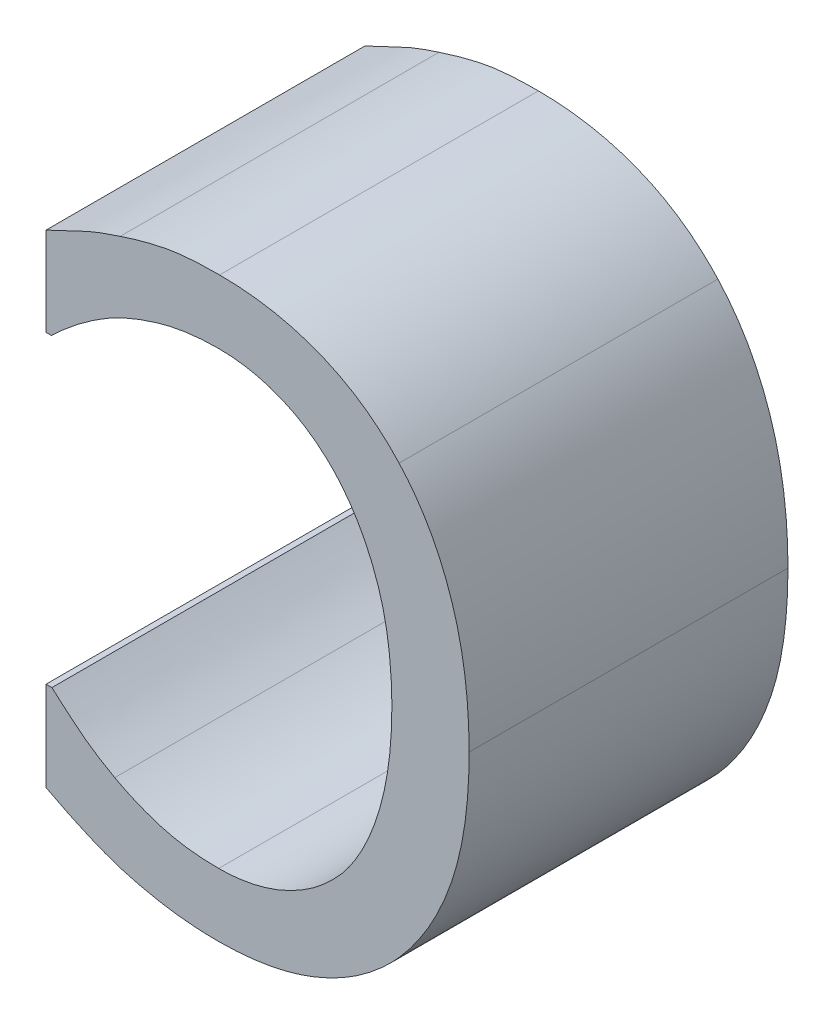
ISO-10303-21;
HEADER;
FILE_DESCRIPTION(('STEP AP214'),'2;1');
FILE_NAME('part.step','',(''),(''),'','','');
FILE_SCHEMA(('AUTOMOTIVE_DESIGN { 1 0 10303 214 1 1 1 1 }'));
ENDSEC;
DATA;
#1=APPLICATION_CONTEXT('core data for automotive mechanical design processes');
#2=APPLICATION_PROTOCOL_DEFINITION('international standard','automotive_design',2000,#1);
#3=PRODUCT_CONTEXT('',#1,'mechanical');
#4=PRODUCT('Part','Part','',(#3));
#5=PRODUCT_RELATED_PRODUCT_CATEGORY('part','',(#4));
#6=PRODUCT_DEFINITION_FORMATION('','',#4);
#7=PRODUCT_DEFINITION_CONTEXT('part definition',#1,'design');
#8=PRODUCT_DEFINITION('design','',#6,#7);
#9=PRODUCT_DEFINITION_SHAPE('','',#8);
#10=(LENGTH_UNIT() NAMED_UNIT(*) SI_UNIT(.MILLI.,.METRE.));
#11=(NAMED_UNIT(*) PLANE_ANGLE_UNIT() SI_UNIT($,.RADIAN.));
#12=(NAMED_UNIT(*) SI_UNIT($,.STERADIAN.) SOLID_ANGLE_UNIT());
#13=UNCERTAINTY_MEASURE_WITH_UNIT(LENGTH_MEASURE(1.E-05),#10,'distance_accuracy_value','');
#14=(GEOMETRIC_REPRESENTATION_CONTEXT(3) GLOBAL_UNCERTAINTY_ASSIGNED_CONTEXT((#13)) GLOBAL_UNIT_ASSIGNED_CONTEXT((#10,
#11,#12)) REPRESENTATION_CONTEXT('',''));
#15=CARTESIAN_POINT('',(0.,0.,0.));
#16=DIRECTION('',(0.,0.,1.));
#17=DIRECTION('',(1.,0.,0.));
#18=AXIS2_PLACEMENT_3D('',#15,#16,#17);
#19=CARTESIAN_POINT('',(6.6298997999722,1.566799218315,0.));
#20=CARTESIAN_POINT('',(6.6298997999722,1.566799218315,0.1));
#21=CARTESIAN_POINT('',(6.6298997999722,1.5889173394833,0.));
#22=CARTESIAN_POINT('',(6.6298997999722,1.5889173394833,0.1));
#23=CARTESIAN_POINT('',(6.6184153909041,1.6229452182036,0.));
#24=CARTESIAN_POINT('',(6.6184153909041,1.6229452182036,0.1));
#25=CARTESIAN_POINT('',(6.607923461632,1.6342878444437,0.));
#26=CARTESIAN_POINT('',(6.607923461632,1.6342878444437,0.1));
#27=B_SPLINE_SURFACE_WITH_KNOTS('',2,1,((#19,#20),(#21,#22),(#23,#24),(#25,#26)),.UNSPECIFIED.,
.F.,.F.,.F.,(3,1,3),(2,2),(-2.,-1.,0.),(0.,0.01),.UNSPECIFIED.);
#28=CARTESIAN_POINT('',(6.607923461632,1.6342878444437,0.));
#29=CARTESIAN_POINT('',(6.6184153909041,1.6229452182036,0.));
#30=CARTESIAN_POINT('',(6.6298997999722,1.5889173394833,0.));
#31=CARTESIAN_POINT('',(6.6298997999722,1.566799218315,0.));
#32=B_SPLINE_CURVE_WITH_KNOTS('',2,(#28,#29,#30,#31),.UNSPECIFIED.,.F.,.F.,(3,1,3),(0.,1.,2.),.UNSPECIFIED.);
#33=CARTESIAN_POINT('',(6.607923461632,1.6342878444437,0.));
#34=VERTEX_POINT('',#33);
#35=CARTESIAN_POINT('',(6.6298997999722,1.566799218315,0.));
#36=VERTEX_POINT('',#35);
#37=EDGE_CURVE('E11',#34,#36,#32,.T.);
#38=DIRECTION('',(0.,0.,1.));
#39=VECTOR('',#38,1.);
#40=CARTESIAN_POINT('',(6.607923461632,1.6342878444437,0.));
#41=LINE('',#40,#39);
#42=CARTESIAN_POINT('',(6.607923461632,1.6342878444437,0.1));
#43=VERTEX_POINT('',#42);
#44=EDGE_CURVE('E28',#34,#43,#41,.T.);
#45=CARTESIAN_POINT('',(6.6298997999722,1.566799218315,0.1));
#46=CARTESIAN_POINT('',(6.6298997999722,1.5889173394833,0.1));
#47=CARTESIAN_POINT('',(6.6184153909041,1.6229452182036,0.1));
#48=CARTESIAN_POINT('',(6.607923461632,1.6342878444437,0.1));
#49=B_SPLINE_CURVE_WITH_KNOTS('',2,(#45,#46,#47,#48),.UNSPECIFIED.,.F.,.F.,(3,1,3),(-2.,-1.,0.),.UNSPECIFIED.);
#50=CARTESIAN_POINT('',(6.6298997999722,1.566799218315,0.1));
#51=VERTEX_POINT('',#50);
#52=EDGE_CURVE('E176',#51,#43,#49,.T.);
#53=DIRECTION('',(0.,0.,1.));
#54=VECTOR('',#53,1.);
#55=CARTESIAN_POINT('',(6.6298997999722,1.566799218315,0.));
#56=LINE('',#55,#54);
#57=EDGE_CURVE('E460',#36,#51,#56,.T.);
#58=ORIENTED_EDGE('',*,*,#37,.F.);
#59=ORIENTED_EDGE('',*,*,#44,.T.);
#60=ORIENTED_EDGE('',*,*,#52,.F.);
#61=ORIENTED_EDGE('',*,*,#57,.F.);
#62=EDGE_LOOP('',(#58,#59,#60,#61));
#63=FACE_BOUND('',#62,.T.);
#64=ADVANCED_FACE('F17',(#63),#27,.T.);
#65=CARTESIAN_POINT('',(6.60806524446,1.5001612891544,0.));
#66=CARTESIAN_POINT('',(6.60806524446,1.5001612891544,0.1));
#67=CARTESIAN_POINT('',(6.6186989565601,1.5122128295345,0.));
#68=CARTESIAN_POINT('',(6.6186989565601,1.5122128295345,0.1));
#69=CARTESIAN_POINT('',(6.6298997999722,1.5448228799748,0.));
#70=CARTESIAN_POINT('',(6.6298997999722,1.5448228799748,0.1));
#71=CARTESIAN_POINT('',(6.6298997999722,1.566799218315,0.));
#72=CARTESIAN_POINT('',(6.6298997999722,1.566799218315,0.1));
#73=B_SPLINE_SURFACE_WITH_KNOTS('',2,1,((#65,#66),(#67,#68),(#69,#70),(#71,#72)),.UNSPECIFIED.,
.F.,.F.,.F.,(3,1,3),(2,2),(-2.,-1.,0.),(0.,0.01),.UNSPECIFIED.);
#74=CARTESIAN_POINT('',(6.6298997999722,1.566799218315,0.));
#75=CARTESIAN_POINT('',(6.6298997999722,1.5448228799748,0.));
#76=CARTESIAN_POINT('',(6.6186989565601,1.5122128295345,0.));
#77=CARTESIAN_POINT('',(6.60806524446,1.5001612891544,0.));
#78=B_SPLINE_CURVE_WITH_KNOTS('',2,(#74,#75,#76,#77),.UNSPECIFIED.,.F.,.F.,(3,1,3),(0.,1.,2.),.UNSPECIFIED.);
#79=CARTESIAN_POINT('',(6.60806524446,1.5001612891544,0.));
#80=VERTEX_POINT('',#79);
#81=EDGE_CURVE('E453',#36,#80,#78,.T.);
#82=CARTESIAN_POINT('',(6.60806524446,1.5001612891544,0.1));
#83=CARTESIAN_POINT('',(6.6186989565601,1.5122128295345,0.1));
#84=CARTESIAN_POINT('',(6.6298997999722,1.5448228799748,0.1));
#85=CARTESIAN_POINT('',(6.6298997999722,1.566799218315,0.1));
#86=B_SPLINE_CURVE_WITH_KNOTS('',2,(#82,#83,#84,#85),.UNSPECIFIED.,.F.,.F.,(3,1,3),(-2.,-1.,0.),.UNSPECIFIED.);
#87=CARTESIAN_POINT('',(6.60806524446,1.5001612891544,0.1));
#88=VERTEX_POINT('',#87);
#89=EDGE_CURVE('E449',#88,#51,#86,.T.);
#90=DIRECTION('',(0.,0.,1.));
#91=VECTOR('',#90,1.);
#92=CARTESIAN_POINT('',(6.60806524446,1.5001612891544,0.));
#93=LINE('',#92,#91);
#94=EDGE_CURVE('E443',#80,#88,#93,.T.);
#95=ORIENTED_EDGE('',*,*,#81,.F.);
#96=ORIENTED_EDGE('',*,*,#57,.T.);
#97=ORIENTED_EDGE('',*,*,#89,.F.);
#98=ORIENTED_EDGE('',*,*,#94,.F.);
#99=EDGE_LOOP('',(#95,#96,#97,#98));
#100=FACE_BOUND('',#99,.T.);
#101=ADVANCED_FACE('F538',(#100),#73,.T.);
#102=CARTESIAN_POINT('',(6.5512103304314,1.4760582083942,0.));
#103=CARTESIAN_POINT('',(6.5512103304314,1.4760582083942,0.1));
#104=CARTESIAN_POINT('',(6.5689331839316,1.4760582083942,0.));
#105=CARTESIAN_POINT('',(6.5689331839316,1.4760582083942,0.1));
#106=CARTESIAN_POINT('',(6.5975733151879,1.4883933144303,0.));
#107=CARTESIAN_POINT('',(6.5975733151879,1.4883933144303,0.1));
#108=CARTESIAN_POINT('',(6.60806524446,1.5001612891544,0.));
#109=CARTESIAN_POINT('',(6.60806524446,1.5001612891544,0.1));
#110=B_SPLINE_SURFACE_WITH_KNOTS('',2,1,((#102,#103),(#104,#105),(#106,#107),(#108,#109)),
.UNSPECIFIED.,.F.,.F.,.F.,(3,1,3),(2,2),(-2.,-1.,0.),(0.,0.01),.UNSPECIFIED.);
#111=CARTESIAN_POINT('',(6.60806524446,1.5001612891544,0.));
#112=CARTESIAN_POINT('',(6.5975733151879,1.4883933144303,0.));
#113=CARTESIAN_POINT('',(6.5689331839316,1.4760582083942,0.));
#114=CARTESIAN_POINT('',(6.5512103304314,1.4760582083942,0.));
#115=B_SPLINE_CURVE_WITH_KNOTS('',2,(#111,#112,#113,#114),.UNSPECIFIED.,.F.,.F.,(3,1,3),(0.,1.,
2.),.UNSPECIFIED.);
#116=CARTESIAN_POINT('',(6.5512103304314,1.4760582083942,0.));
#117=VERTEX_POINT('',#116);
#118=EDGE_CURVE('E436',#80,#117,#115,.T.);
#119=CARTESIAN_POINT('',(6.5512103304314,1.4760582083942,0.1));
#120=CARTESIAN_POINT('',(6.5689331839316,1.4760582083942,0.1));
#121=CARTESIAN_POINT('',(6.5975733151879,1.4883933144303,0.1));
#122=CARTESIAN_POINT('',(6.60806524446,1.5001612891544,0.1));
#123=B_SPLINE_CURVE_WITH_KNOTS('',2,(#119,#120,#121,#122),.UNSPECIFIED.,.F.,.F.,(3,1,3),(-2.,
-1.,0.),.UNSPECIFIED.);
#124=CARTESIAN_POINT('',(6.5512103304314,1.4760582083942,0.1));
#125=VERTEX_POINT('',#124);
#126=EDGE_CURVE('E431',#125,#88,#123,.T.);
#127=DIRECTION('',(0.,0.,1.));
#128=VECTOR('',#127,1.);
#129=CARTESIAN_POINT('',(6.5512103304314,1.4760582083942,0.));
#130=LINE('',#129,#128);
#131=EDGE_CURVE('E425',#117,#125,#130,.T.);
#132=ORIENTED_EDGE('',*,*,#118,.F.);
#133=ORIENTED_EDGE('',*,*,#94,.T.);
#134=ORIENTED_EDGE('',*,*,#126,.F.);
#135=ORIENTED_EDGE('',*,*,#131,.F.);
#136=EDGE_LOOP('',(#132,#133,#134,#135));
#137=FACE_BOUND('',#136,.T.);
#138=ADVANCED_FACE('F534',(#137),#110,.T.);
#139=CARTESIAN_POINT('',(6.5204434567551,1.4805952588902,0.));
#140=CARTESIAN_POINT('',(6.5204434567551,1.4805952588902,0.1));
#141=CARTESIAN_POINT('',(6.5269654668432,1.4786102992982,0.));
#142=CARTESIAN_POINT('',(6.5269654668432,1.4786102992982,0.1));
#143=CARTESIAN_POINT('',(6.5424197950953,1.4760582083942,0.));
#144=CARTESIAN_POINT('',(6.5424197950953,1.4760582083942,0.1));
#145=CARTESIAN_POINT('',(6.5512103304314,1.4760582083942,0.));
#146=CARTESIAN_POINT('',(6.5512103304314,1.4760582083942,0.1));
#147=B_SPLINE_SURFACE_WITH_KNOTS('',2,1,((#139,#140),(#141,#142),(#143,#144),(#145,#146)),
.UNSPECIFIED.,.F.,.F.,.F.,(3,1,3),(2,2),(-2.,-1.,0.),(0.,0.01),.UNSPECIFIED.);
#148=CARTESIAN_POINT('',(6.5512103304314,1.4760582083942,0.));
#149=CARTESIAN_POINT('',(6.5424197950953,1.4760582083942,0.));
#150=CARTESIAN_POINT('',(6.5269654668432,1.4786102992982,0.));
#151=CARTESIAN_POINT('',(6.5204434567551,1.4805952588902,0.));
#152=B_SPLINE_CURVE_WITH_KNOTS('',2,(#148,#149,#150,#151),.UNSPECIFIED.,.F.,.F.,(3,1,3),(0.,1.,
2.),.UNSPECIFIED.);
#153=CARTESIAN_POINT('',(6.5204434567551,1.4805952588902,0.));
#154=VERTEX_POINT('',#153);
#155=EDGE_CURVE('E418',#117,#154,#152,.T.);
#156=CARTESIAN_POINT('',(6.5204434567551,1.4805952588902,0.1));
#157=CARTESIAN_POINT('',(6.5269654668432,1.4786102992982,0.1));
#158=CARTESIAN_POINT('',(6.5424197950953,1.4760582083942,0.1));
#159=CARTESIAN_POINT('',(6.5512103304314,1.4760582083942,0.1));
#160=B_SPLINE_CURVE_WITH_KNOTS('',2,(#156,#157,#158,#159),.UNSPECIFIED.,.F.,.F.,(3,1,3),(-2.,
-1.,0.),.UNSPECIFIED.);
#161=CARTESIAN_POINT('',(6.5204434567551,1.4805952588902,0.1));
#162=VERTEX_POINT('',#161);
#163=EDGE_CURVE('E413',#162,#125,#160,.T.);
#164=DIRECTION('',(0.,0.,1.));
#165=VECTOR('',#164,1.);
#166=CARTESIAN_POINT('',(6.5204434567551,1.4805952588902,0.));
#167=LINE('',#166,#165);
#168=EDGE_CURVE('E407',#154,#162,#167,.T.);
#169=ORIENTED_EDGE('',*,*,#155,.F.);
#170=ORIENTED_EDGE('',*,*,#131,.T.);
#171=ORIENTED_EDGE('',*,*,#163,.F.);
#172=ORIENTED_EDGE('',*,*,#168,.F.);
#173=EDGE_LOOP('',(#169,#170,#171,#172));
#174=FACE_BOUND('',#173,.T.);
#175=ADVANCED_FACE('F530',(#174),#147,.T.);
#176=CARTESIAN_POINT('',(6.4971910729629,1.4908036225063,0.));
#177=CARTESIAN_POINT('',(6.4971910729629,1.4908036225063,0.1));
#178=CARTESIAN_POINT('',(6.503004168911,1.4876844002903,0.));
#179=CARTESIAN_POINT('',(6.503004168911,1.4876844002903,0.1));
#180=CARTESIAN_POINT('',(6.5147721436351,1.4824384356542,0.));
#181=CARTESIAN_POINT('',(6.5147721436351,1.4824384356542,0.1));
#182=CARTESIAN_POINT('',(6.5204434567551,1.4805952588902,0.));
#183=CARTESIAN_POINT('',(6.5204434567551,1.4805952588902,0.1));
#184=B_SPLINE_SURFACE_WITH_KNOTS('',2,1,((#176,#177),(#178,#179),(#180,#181),(#182,#183)),
.UNSPECIFIED.,.F.,.F.,.F.,(3,1,3),(2,2),(-2.,-1.,0.),(0.,0.01),.UNSPECIFIED.);
#185=CARTESIAN_POINT('',(6.5204434567551,1.4805952588902,0.));
#186=CARTESIAN_POINT('',(6.5147721436351,1.4824384356542,0.));
#187=CARTESIAN_POINT('',(6.503004168911,1.4876844002903,0.));
#188=CARTESIAN_POINT('',(6.4971910729629,1.4908036225063,0.));
#189=B_SPLINE_CURVE_WITH_KNOTS('',2,(#185,#186,#187,#188),.UNSPECIFIED.,.F.,.F.,(3,1,3),(0.,1.,
2.),.UNSPECIFIED.);
#190=CARTESIAN_POINT('',(6.4971910729629,1.4908036225063,0.));
#191=VERTEX_POINT('',#190);
#192=EDGE_CURVE('E400',#154,#191,#189,.T.);
#193=CARTESIAN_POINT('',(6.4971910729629,1.4908036225063,0.1));
#194=CARTESIAN_POINT('',(6.503004168911,1.4876844002903,0.1));
#195=CARTESIAN_POINT('',(6.5147721436351,1.4824384356542,0.1));
#196=CARTESIAN_POINT('',(6.5204434567551,1.4805952588902,0.1));
#197=B_SPLINE_CURVE_WITH_KNOTS('',2,(#193,#194,#195,#196),.UNSPECIFIED.,.F.,.F.,(3,1,3),(-2.,
-1.,0.),.UNSPECIFIED.);
#198=CARTESIAN_POINT('',(6.4971910729629,1.4908036225063,0.1));
#199=VERTEX_POINT('',#198);
#200=EDGE_CURVE('E395',#199,#162,#197,.T.);
#201=DIRECTION('',(0.,0.,1.));
#202=VECTOR('',#201,1.);
#203=CARTESIAN_POINT('',(6.4971910729629,1.4908036225063,0.));
#204=LINE('',#203,#202);
#205=EDGE_CURVE('E392',#191,#199,#204,.T.);
#206=ORIENTED_EDGE('',*,*,#192,.F.);
#207=ORIENTED_EDGE('',*,*,#168,.T.);
#208=ORIENTED_EDGE('',*,*,#200,.F.);
#209=ORIENTED_EDGE('',*,*,#205,.F.);
#210=EDGE_LOOP('',(#206,#207,#208,#209));
#211=FACE_BOUND('',#210,.T.);
#212=ADVANCED_FACE('F526',(#211),#184,.T.);
#213=CARTESIAN_POINT('',(6.4971910729629,1.5188766224506,0.));
#214=DIRECTION('',(-1.,0.,0.));
#215=DIRECTION('',(0.,-1.,0.));
#216=AXIS2_PLACEMENT_3D('',#213,#214,#215);
#217=PLANE('',#216);
#218=DIRECTION('',(0.,1.,0.));
#219=VECTOR('',#218,1.);
#220=CARTESIAN_POINT('',(6.4971910729629,1.4908036225063,0.));
#221=LINE('',#220,#219);
#222=CARTESIAN_POINT('',(6.4971910729629,1.5188766224506,0.));
#223=VERTEX_POINT('',#222);
#224=EDGE_CURVE('E390',#191,#223,#221,.T.);
#225=ORIENTED_EDGE('',*,*,#224,.F.);
#226=ORIENTED_EDGE('',*,*,#205,.T.);
#227=DIRECTION('',(0.,-1.,0.));
#228=VECTOR('',#227,1.);
#229=CARTESIAN_POINT('',(6.4971910729629,1.4908036225063,0.1));
#230=LINE('',#229,#228);
#231=CARTESIAN_POINT('',(6.4971910729629,1.5188766224506,0.1));
#232=VERTEX_POINT('',#231);
#233=EDGE_CURVE('E387',#232,#199,#230,.T.);
#234=ORIENTED_EDGE('',*,*,#233,.F.);
#235=DIRECTION('',(0.,0.,1.));
#236=VECTOR('',#235,1.);
#237=CARTESIAN_POINT('',(6.4971910729629,1.5188766224506,0.));
#238=LINE('',#237,#236);
#239=EDGE_CURVE('E384',#223,#232,#238,.T.);
#240=ORIENTED_EDGE('',*,*,#239,.F.);
#241=EDGE_LOOP('',(#225,#226,#234,#240));
#242=FACE_BOUND('',#241,.T.);
#243=ADVANCED_FACE('F522',(#242),#217,.T.);
#244=CARTESIAN_POINT('',(6.4990342497269,1.5188766224506,0.));
#245=DIRECTION('',(0.,1.,0.));
#246=DIRECTION('',(-1.,0.,0.));
#247=AXIS2_PLACEMENT_3D('',#244,#245,#246);
#248=PLANE('',#247);
#249=DIRECTION('',(1.,0.,0.));
#250=VECTOR('',#249,1.);
#251=CARTESIAN_POINT('',(6.4971910729629,1.5188766224506,0.));
#252=LINE('',#251,#250);
#253=CARTESIAN_POINT('',(6.4990342497269,1.5188766224506,0.));
#254=VERTEX_POINT('',#253);
#255=EDGE_CURVE('E382',#223,#254,#252,.T.);
#256=ORIENTED_EDGE('',*,*,#255,.F.);
#257=ORIENTED_EDGE('',*,*,#239,.T.);
#258=DIRECTION('',(-1.,0.,0.));
#259=VECTOR('',#258,1.);
#260=CARTESIAN_POINT('',(6.4971910729629,1.5188766224506,0.1));
#261=LINE('',#260,#259);
#262=CARTESIAN_POINT('',(6.4990342497269,1.5188766224506,0.1));
#263=VERTEX_POINT('',#262);
#264=EDGE_CURVE('E379',#263,#232,#261,.T.);
#265=ORIENTED_EDGE('',*,*,#264,.F.);
#266=DIRECTION('',(0.,0.,1.));
#267=VECTOR('',#266,1.);
#268=CARTESIAN_POINT('',(6.4990342497269,1.5188766224506,0.));
#269=LINE('',#268,#267);
#270=EDGE_CURVE('E373',#254,#263,#269,.T.);
#271=ORIENTED_EDGE('',*,*,#270,.F.);
#272=EDGE_LOOP('',(#256,#257,#265,#271));
#273=FACE_BOUND('',#272,.T.);
#274=ADVANCED_FACE('F518',(#273),#248,.T.);
#275=CARTESIAN_POINT('',(6.5187420628191,1.5042729911664,0.));
#276=CARTESIAN_POINT('',(6.5187420628191,1.5042729911664,0.1));
#277=CARTESIAN_POINT('',(6.511794704247,1.5081011275225,0.));
#278=CARTESIAN_POINT('',(6.511794704247,1.5081011275225,0.1));
#279=CARTESIAN_POINT('',(6.5021534719429,1.5160409658905,0.));
#280=CARTESIAN_POINT('',(6.5021534719429,1.5160409658905,0.1));
#281=CARTESIAN_POINT('',(6.4990342497269,1.5188766224506,0.));
#282=CARTESIAN_POINT('',(6.4990342497269,1.5188766224506,0.1));
#283=B_SPLINE_SURFACE_WITH_KNOTS('',2,1,((#275,#276),(#277,#278),(#279,#280),(#281,#282)),
.UNSPECIFIED.,.F.,.F.,.F.,(3,1,3),(2,2),(-2.,-1.,0.),(0.,0.01),.UNSPECIFIED.);
#284=CARTESIAN_POINT('',(6.4990342497269,1.5188766224506,0.));
#285=CARTESIAN_POINT('',(6.5021534719429,1.5160409658905,0.));
#286=CARTESIAN_POINT('',(6.511794704247,1.5081011275225,0.));
#287=CARTESIAN_POINT('',(6.5187420628191,1.5042729911664,0.));
#288=B_SPLINE_CURVE_WITH_KNOTS('',2,(#284,#285,#286,#287),.UNSPECIFIED.,.F.,.F.,(3,1,3),(0.,1.,
2.),.UNSPECIFIED.);
#289=CARTESIAN_POINT('',(6.5187420628191,1.5042729911664,0.));
#290=VERTEX_POINT('',#289);
#291=EDGE_CURVE('E366',#254,#290,#288,.T.);
#292=CARTESIAN_POINT('',(6.5187420628191,1.5042729911664,0.1));
#293=CARTESIAN_POINT('',(6.511794704247,1.5081011275225,0.1));
#294=CARTESIAN_POINT('',(6.5021534719429,1.5160409658905,0.1));
#295=CARTESIAN_POINT('',(6.4990342497269,1.5188766224506,0.1));
#296=B_SPLINE_CURVE_WITH_KNOTS('',2,(#292,#293,#294,#295),.UNSPECIFIED.,.F.,.F.,(3,1,3),(-2.,
-1.,0.),.UNSPECIFIED.);
#297=CARTESIAN_POINT('',(6.5187420628191,1.5042729911664,0.1));
#298=VERTEX_POINT('',#297);
#299=EDGE_CURVE('E361',#298,#263,#296,.T.);
#300=DIRECTION('',(0.,0.,1.));
#301=VECTOR('',#300,1.);
#302=CARTESIAN_POINT('',(6.5187420628191,1.5042729911664,0.));
#303=LINE('',#302,#301);
#304=EDGE_CURVE('E355',#290,#298,#303,.T.);
#305=ORIENTED_EDGE('',*,*,#291,.F.);
#306=ORIENTED_EDGE('',*,*,#270,.T.);
#307=ORIENTED_EDGE('',*,*,#299,.F.);
#308=ORIENTED_EDGE('',*,*,#304,.F.);
#309=EDGE_LOOP('',(#305,#306,#307,#308));
#310=FACE_BOUND('',#309,.T.);
#311=ADVANCED_FACE('F514',(#310),#283,.T.);
#312=CARTESIAN_POINT('',(6.5513521132594,1.4959078043143,0.));
#313=CARTESIAN_POINT('',(6.5513521132594,1.4959078043143,0.1));
#314=CARTESIAN_POINT('',(6.5411437496433,1.4959078043143,0.));
#315=CARTESIAN_POINT('',(6.5411437496433,1.4959078043143,0.1));
#316=CARTESIAN_POINT('',(6.5254058557352,1.5005866376384,0.));
#317=CARTESIAN_POINT('',(6.5254058557352,1.5005866376384,0.1));
#318=CARTESIAN_POINT('',(6.5187420628191,1.5042729911664,0.));
#319=CARTESIAN_POINT('',(6.5187420628191,1.5042729911664,0.1));
#320=B_SPLINE_SURFACE_WITH_KNOTS('',2,1,((#312,#313),(#314,#315),(#316,#317),(#318,#319)),
.UNSPECIFIED.,.F.,.F.,.F.,(3,1,3),(2,2),(-2.,-1.,0.),(0.,0.01),.UNSPECIFIED.);
#321=CARTESIAN_POINT('',(6.5187420628191,1.5042729911664,0.));
#322=CARTESIAN_POINT('',(6.5254058557352,1.5005866376384,0.));
#323=CARTESIAN_POINT('',(6.5411437496433,1.4959078043143,0.));
#324=CARTESIAN_POINT('',(6.5513521132594,1.4959078043143,0.));
#325=B_SPLINE_CURVE_WITH_KNOTS('',2,(#321,#322,#323,#324),.UNSPECIFIED.,.F.,.F.,(3,1,3),(0.,1.,
2.),.UNSPECIFIED.);
#326=CARTESIAN_POINT('',(6.5513521132594,1.4959078043143,0.));
#327=VERTEX_POINT('',#326);
#328=EDGE_CURVE('E348',#290,#327,#325,.T.);
#329=CARTESIAN_POINT('',(6.5513521132594,1.4959078043143,0.1));
#330=CARTESIAN_POINT('',(6.5411437496433,1.4959078043143,0.1));
#331=CARTESIAN_POINT('',(6.5254058557352,1.5005866376384,0.1));
#332=CARTESIAN_POINT('',(6.5187420628191,1.5042729911664,0.1));
#333=B_SPLINE_CURVE_WITH_KNOTS('',2,(#329,#330,#331,#332),.UNSPECIFIED.,.F.,.F.,(3,1,3),(-2.,
-1.,0.),.UNSPECIFIED.);
#334=CARTESIAN_POINT('',(6.5513521132594,1.4959078043143,0.1));
#335=VERTEX_POINT('',#334);
#336=EDGE_CURVE('E343',#335,#298,#333,.T.);
#337=DIRECTION('',(0.,0.,1.));
#338=VECTOR('',#337,1.);
#339=CARTESIAN_POINT('',(6.5513521132594,1.4959078043143,0.));
#340=LINE('',#339,#338);
#341=EDGE_CURVE('E337',#327,#335,#340,.T.);
#342=ORIENTED_EDGE('',*,*,#328,.F.);
#343=ORIENTED_EDGE('',*,*,#304,.T.);
#344=ORIENTED_EDGE('',*,*,#336,.F.);
#345=ORIENTED_EDGE('',*,*,#341,.F.);
#346=EDGE_LOOP('',(#342,#343,#344,#345));
#347=FACE_BOUND('',#346,.T.);
#348=ADVANCED_FACE('F510',(#347),#320,.T.);
#349=CARTESIAN_POINT('',(6.5900588253038,1.5139142234705,0.));
#350=CARTESIAN_POINT('',(6.5900588253038,1.5139142234705,0.1));
#351=CARTESIAN_POINT('',(6.5825443354197,1.5051236881344,0.));
#352=CARTESIAN_POINT('',(6.5825443354197,1.5051236881344,0.1));
#353=CARTESIAN_POINT('',(6.5625529566715,1.4959078043143,0.));
#354=CARTESIAN_POINT('',(6.5625529566715,1.4959078043143,0.1));
#355=CARTESIAN_POINT('',(6.5513521132594,1.4959078043143,0.));
#356=CARTESIAN_POINT('',(6.5513521132594,1.4959078043143,0.1));
#357=B_SPLINE_SURFACE_WITH_KNOTS('',2,1,((#349,#350),(#351,#352),(#353,#354),(#355,#356)),
.UNSPECIFIED.,.F.,.F.,.F.,(3,1,3),(2,2),(-2.,-1.,0.),(0.,0.01),.UNSPECIFIED.);
#358=CARTESIAN_POINT('',(6.5513521132594,1.4959078043143,0.));
#359=CARTESIAN_POINT('',(6.5625529566715,1.4959078043143,0.));
#360=CARTESIAN_POINT('',(6.5825443354197,1.5051236881344,0.));
#361=CARTESIAN_POINT('',(6.5900588253038,1.5139142234705,0.));
#362=B_SPLINE_CURVE_WITH_KNOTS('',2,(#358,#359,#360,#361),.UNSPECIFIED.,.F.,.F.,(3,1,3),(0.,1.,
2.),.UNSPECIFIED.);
#363=CARTESIAN_POINT('',(6.5900588253038,1.5139142234705,0.));
#364=VERTEX_POINT('',#363);
#365=EDGE_CURVE('E330',#327,#364,#362,.T.);
#366=CARTESIAN_POINT('',(6.5900588253038,1.5139142234705,0.1));
#367=CARTESIAN_POINT('',(6.5825443354197,1.5051236881344,0.1));
#368=CARTESIAN_POINT('',(6.5625529566715,1.4959078043143,0.1));
#369=CARTESIAN_POINT('',(6.5513521132594,1.4959078043143,0.1));
#370=B_SPLINE_CURVE_WITH_KNOTS('',2,(#366,#367,#368,#369),.UNSPECIFIED.,.F.,.F.,(3,1,3),(-2.,
-1.,0.),.UNSPECIFIED.);
#371=CARTESIAN_POINT('',(6.5900588253038,1.5139142234705,0.1));
#372=VERTEX_POINT('',#371);
#373=EDGE_CURVE('E325',#372,#335,#370,.T.);
#374=DIRECTION('',(0.,0.,1.));
#375=VECTOR('',#374,1.);
#376=CARTESIAN_POINT('',(6.5900588253038,1.5139142234705,0.));
#377=LINE('',#376,#375);
#378=EDGE_CURVE('E319',#364,#372,#377,.T.);
#379=ORIENTED_EDGE('',*,*,#365,.F.);
#380=ORIENTED_EDGE('',*,*,#341,.T.);
#381=ORIENTED_EDGE('',*,*,#373,.F.);
#382=ORIENTED_EDGE('',*,*,#378,.F.);
#383=EDGE_LOOP('',(#379,#380,#381,#382));
#384=FACE_BOUND('',#383,.T.);
#385=ADVANCED_FACE('F506',(#384),#357,.T.);
#386=CARTESIAN_POINT('',(6.605654936384,1.566799218315,0.));
#387=CARTESIAN_POINT('',(6.605654936384,1.566799218315,0.1));
#388=CARTESIAN_POINT('',(6.605654936384,1.5499270617829,0.));
#389=CARTESIAN_POINT('',(6.605654936384,1.5499270617829,0.1));
#390=CARTESIAN_POINT('',(6.5974315323599,1.5228465416346,0.));
#391=CARTESIAN_POINT('',(6.5974315323599,1.5228465416346,0.1));
#392=CARTESIAN_POINT('',(6.5900588253038,1.5139142234705,0.));
#393=CARTESIAN_POINT('',(6.5900588253038,1.5139142234705,0.1));
#394=B_SPLINE_SURFACE_WITH_KNOTS('',2,1,((#386,#387),(#388,#389),(#390,#391),(#392,#393)),
.UNSPECIFIED.,.F.,.F.,.F.,(3,1,3),(2,2),(-2.,-1.,0.),(0.,0.01),.UNSPECIFIED.);
#395=CARTESIAN_POINT('',(6.5900588253038,1.5139142234705,0.));
#396=CARTESIAN_POINT('',(6.5974315323599,1.5228465416346,0.));
#397=CARTESIAN_POINT('',(6.605654936384,1.5499270617829,0.));
#398=CARTESIAN_POINT('',(6.605654936384,1.566799218315,0.));
#399=B_SPLINE_CURVE_WITH_KNOTS('',2,(#395,#396,#397,#398),.UNSPECIFIED.,.F.,.F.,(3,1,3),(0.,1.,
2.),.UNSPECIFIED.);
#400=CARTESIAN_POINT('',(6.605654936384,1.566799218315,0.));
#401=VERTEX_POINT('',#400);
#402=EDGE_CURVE('E312',#364,#401,#399,.T.);
#403=CARTESIAN_POINT('',(6.605654936384,1.566799218315,0.1));
#404=CARTESIAN_POINT('',(6.605654936384,1.5499270617829,0.1));
#405=CARTESIAN_POINT('',(6.5974315323599,1.5228465416346,0.1));
#406=CARTESIAN_POINT('',(6.5900588253038,1.5139142234705,0.1));
#407=B_SPLINE_CURVE_WITH_KNOTS('',2,(#403,#404,#405,#406),.UNSPECIFIED.,.F.,.F.,(3,1,3),(-2.,
-1.,0.),.UNSPECIFIED.);
#408=CARTESIAN_POINT('',(6.605654936384,1.566799218315,0.1));
#409=VERTEX_POINT('',#408);
#410=EDGE_CURVE('E307',#409,#372,#407,.T.);
#411=DIRECTION('',(0.,0.,1.));
#412=VECTOR('',#411,1.);
#413=CARTESIAN_POINT('',(6.605654936384,1.566799218315,0.));
#414=LINE('',#413,#412);
#415=EDGE_CURVE('E301',#401,#409,#414,.T.);
#416=ORIENTED_EDGE('',*,*,#402,.F.);
#417=ORIENTED_EDGE('',*,*,#378,.T.);
#418=ORIENTED_EDGE('',*,*,#410,.F.);
#419=ORIENTED_EDGE('',*,*,#415,.F.);
#420=EDGE_LOOP('',(#416,#417,#418,#419));
#421=FACE_BOUND('',#420,.T.);
#422=ADVANCED_FACE('F502',(#421),#394,.T.);
#423=CARTESIAN_POINT('',(6.5894916939918,1.6196842131595,0.));
#424=CARTESIAN_POINT('',(6.5894916939918,1.6196842131595,0.1));
#425=CARTESIAN_POINT('',(6.5970061838759,1.6107518949955,0.));
#426=CARTESIAN_POINT('',(6.5970061838759,1.6107518949955,0.1));
#427=CARTESIAN_POINT('',(6.605654936384,1.5848056374712,0.));
#428=CARTESIAN_POINT('',(6.605654936384,1.5848056374712,0.1));
#429=CARTESIAN_POINT('',(6.605654936384,1.566799218315,0.));
#430=CARTESIAN_POINT('',(6.605654936384,1.566799218315,0.1));
#431=B_SPLINE_SURFACE_WITH_KNOTS('',2,1,((#423,#424),(#425,#426),(#427,#428),(#429,#430)),
.UNSPECIFIED.,.F.,.F.,.F.,(3,1,3),(2,2),(-2.,-1.,0.),(0.,0.01),.UNSPECIFIED.);
#432=CARTESIAN_POINT('',(6.605654936384,1.566799218315,0.));
#433=CARTESIAN_POINT('',(6.605654936384,1.5848056374712,0.));
#434=CARTESIAN_POINT('',(6.5970061838759,1.6107518949955,0.));
#435=CARTESIAN_POINT('',(6.5894916939918,1.6196842131595,0.));
#436=B_SPLINE_CURVE_WITH_KNOTS('',2,(#432,#433,#434,#435),.UNSPECIFIED.,.F.,.F.,(3,1,3),(0.,1.,
2.),.UNSPECIFIED.);
#437=CARTESIAN_POINT('',(6.5894916939918,1.6196842131595,0.));
#438=VERTEX_POINT('',#437);
#439=EDGE_CURVE('E294',#401,#438,#436,.T.);
#440=CARTESIAN_POINT('',(6.5894916939918,1.6196842131595,0.1));
#441=CARTESIAN_POINT('',(6.5970061838759,1.6107518949955,0.1));
#442=CARTESIAN_POINT('',(6.605654936384,1.5848056374712,0.1));
#443=CARTESIAN_POINT('',(6.605654936384,1.566799218315,0.1));
#444=B_SPLINE_CURVE_WITH_KNOTS('',2,(#440,#441,#442,#443),.UNSPECIFIED.,.F.,.F.,(3,1,3),(-2.,
-1.,0.),.UNSPECIFIED.);
#445=CARTESIAN_POINT('',(6.5894916939918,1.6196842131595,0.1));
#446=VERTEX_POINT('',#445);
#447=EDGE_CURVE('E289',#446,#409,#444,.T.);
#448=DIRECTION('',(0.,0.,1.));
#449=VECTOR('',#448,1.);
#450=CARTESIAN_POINT('',(6.5894916939918,1.6196842131595,0.));
#451=LINE('',#450,#449);
#452=EDGE_CURVE('E283',#438,#446,#451,.T.);
#453=ORIENTED_EDGE('',*,*,#439,.F.);
#454=ORIENTED_EDGE('',*,*,#415,.T.);
#455=ORIENTED_EDGE('',*,*,#447,.F.);
#456=ORIENTED_EDGE('',*,*,#452,.F.);
#457=EDGE_LOOP('',(#453,#454,#455,#456));
#458=FACE_BOUND('',#457,.T.);
#459=ADVANCED_FACE('F498',(#458),#431,.T.);
#460=CARTESIAN_POINT('',(6.5513521132594,1.6371235010037,0.));
#461=CARTESIAN_POINT('',(6.5513521132594,1.6371235010037,0.1));
#462=CARTESIAN_POINT('',(6.5624111738435,1.6371235010037,0.));
#463=CARTESIAN_POINT('',(6.5624111738435,1.6371235010037,0.1));
#464=CARTESIAN_POINT('',(6.5821189869357,1.6283329656676,0.));
#465=CARTESIAN_POINT('',(6.5821189869357,1.6283329656676,0.1));
#466=CARTESIAN_POINT('',(6.5894916939918,1.6196842131595,0.));
#467=CARTESIAN_POINT('',(6.5894916939918,1.6196842131595,0.1));
#468=B_SPLINE_SURFACE_WITH_KNOTS('',2,1,((#460,#461),(#462,#463),(#464,#465),(#466,#467)),
.UNSPECIFIED.,.F.,.F.,.F.,(3,1,3),(2,2),(-2.,-1.,0.),(0.,0.01),.UNSPECIFIED.);
#469=CARTESIAN_POINT('',(6.5894916939918,1.6196842131595,0.));
#470=CARTESIAN_POINT('',(6.5821189869357,1.6283329656676,0.));
#471=CARTESIAN_POINT('',(6.5624111738435,1.6371235010037,0.));
#472=CARTESIAN_POINT('',(6.5513521132594,1.6371235010037,0.));
#473=B_SPLINE_CURVE_WITH_KNOTS('',2,(#469,#470,#471,#472),.UNSPECIFIED.,.F.,.F.,(3,1,3),(0.,1.,
2.),.UNSPECIFIED.);
#474=CARTESIAN_POINT('',(6.5513521132594,1.6371235010037,0.));
#475=VERTEX_POINT('',#474);
#476=EDGE_CURVE('E276',#438,#475,#473,.T.);
#477=CARTESIAN_POINT('',(6.5513521132594,1.6371235010037,0.1));
#478=CARTESIAN_POINT('',(6.5624111738435,1.6371235010037,0.1));
#479=CARTESIAN_POINT('',(6.5821189869357,1.6283329656676,0.1));
#480=CARTESIAN_POINT('',(6.5894916939918,1.6196842131595,0.1));
#481=B_SPLINE_CURVE_WITH_KNOTS('',2,(#477,#478,#479,#480),.UNSPECIFIED.,.F.,.F.,(3,1,3),(-2.,
-1.,0.),.UNSPECIFIED.);
#482=CARTESIAN_POINT('',(6.5513521132594,1.6371235010037,0.1));
#483=VERTEX_POINT('',#482);
#484=EDGE_CURVE('E271',#483,#446,#481,.T.);
#485=DIRECTION('',(0.,0.,1.));
#486=VECTOR('',#485,1.);
#487=CARTESIAN_POINT('',(6.5513521132594,1.6371235010037,0.));
#488=LINE('',#487,#486);
#489=EDGE_CURVE('E265',#475,#483,#488,.T.);
#490=ORIENTED_EDGE('',*,*,#476,.F.);
#491=ORIENTED_EDGE('',*,*,#452,.T.);
#492=ORIENTED_EDGE('',*,*,#484,.F.);
#493=ORIENTED_EDGE('',*,*,#489,.F.);
#494=EDGE_LOOP('',(#490,#491,#492,#493));
#495=FACE_BOUND('',#494,.T.);
#496=ADVANCED_FACE('F494',(#495),#468,.T.);
#497=CARTESIAN_POINT('',(6.5174660173671,1.6284747484956,0.));
#498=CARTESIAN_POINT('',(6.5174660173671,1.6284747484956,0.1));
#499=CARTESIAN_POINT('',(6.5241298102832,1.6321611020237,0.));
#500=CARTESIAN_POINT('',(6.5241298102832,1.6321611020237,0.1));
#501=CARTESIAN_POINT('',(6.5412855324713,1.6371235010037,0.));
#502=CARTESIAN_POINT('',(6.5412855324713,1.6371235010037,0.1));
#503=CARTESIAN_POINT('',(6.5513521132594,1.6371235010037,0.));
#504=CARTESIAN_POINT('',(6.5513521132594,1.6371235010037,0.1));
#505=B_SPLINE_SURFACE_WITH_KNOTS('',2,1,((#497,#498),(#499,#500),(#501,#502),(#503,#504)),
.UNSPECIFIED.,.F.,.F.,.F.,(3,1,3),(2,2),(-2.,-1.,0.),(0.,0.01),.UNSPECIFIED.);
#506=CARTESIAN_POINT('',(6.5513521132594,1.6371235010037,0.));
#507=CARTESIAN_POINT('',(6.5412855324713,1.6371235010037,0.));
#508=CARTESIAN_POINT('',(6.5241298102832,1.6321611020237,0.));
#509=CARTESIAN_POINT('',(6.5174660173671,1.6284747484956,0.));
#510=B_SPLINE_CURVE_WITH_KNOTS('',2,(#506,#507,#508,#509),.UNSPECIFIED.,.F.,.F.,(3,1,3),(0.,1.,
2.),.UNSPECIFIED.);
#511=CARTESIAN_POINT('',(6.5174660173671,1.6284747484956,0.));
#512=VERTEX_POINT('',#511);
#513=EDGE_CURVE('E258',#475,#512,#510,.T.);
#514=CARTESIAN_POINT('',(6.5174660173671,1.6284747484956,0.1));
#515=CARTESIAN_POINT('',(6.5241298102832,1.6321611020237,0.1));
#516=CARTESIAN_POINT('',(6.5412855324713,1.6371235010037,0.1));
#517=CARTESIAN_POINT('',(6.5513521132594,1.6371235010037,0.1));
#518=B_SPLINE_CURVE_WITH_KNOTS('',2,(#514,#515,#516,#517),.UNSPECIFIED.,.F.,.F.,(3,1,3),(-2.,
-1.,0.),.UNSPECIFIED.);
#519=CARTESIAN_POINT('',(6.5174660173671,1.6284747484956,0.1));
#520=VERTEX_POINT('',#519);
#521=EDGE_CURVE('E253',#520,#483,#518,.T.);
#522=DIRECTION('',(0.,0.,1.));
#523=VECTOR('',#522,1.);
#524=CARTESIAN_POINT('',(6.5174660173671,1.6284747484956,0.));
#525=LINE('',#524,#523);
#526=EDGE_CURVE('E247',#512,#520,#525,.T.);
#527=ORIENTED_EDGE('',*,*,#513,.F.);
#528=ORIENTED_EDGE('',*,*,#489,.T.);
#529=ORIENTED_EDGE('',*,*,#521,.F.);
#530=ORIENTED_EDGE('',*,*,#526,.F.);
#531=EDGE_LOOP('',(#527,#528,#529,#530));
#532=FACE_BOUND('',#531,.T.);
#533=ADVANCED_FACE('F490',(#532),#505,.T.);
#534=CARTESIAN_POINT('',(6.4988924668989,1.6144382485235,0.));
#535=CARTESIAN_POINT('',(6.4988924668989,1.6144382485235,0.1));
#536=CARTESIAN_POINT('',(6.5015863406309,1.6171321222555,0.));
#537=CARTESIAN_POINT('',(6.5015863406309,1.6171321222555,0.1));
#538=CARTESIAN_POINT('',(6.511085790107,1.6247883949676,0.));
#539=CARTESIAN_POINT('',(6.511085790107,1.6247883949676,0.1));
#540=CARTESIAN_POINT('',(6.5174660173671,1.6284747484956,0.));
#541=CARTESIAN_POINT('',(6.5174660173671,1.6284747484956,0.1));
#542=B_SPLINE_SURFACE_WITH_KNOTS('',2,1,((#534,#535),(#536,#537),(#538,#539),(#540,#541)),
.UNSPECIFIED.,.F.,.F.,.F.,(3,1,3),(2,2),(-2.,-1.,0.),(0.,0.01),.UNSPECIFIED.);
#543=CARTESIAN_POINT('',(6.5174660173671,1.6284747484956,0.));
#544=CARTESIAN_POINT('',(6.511085790107,1.6247883949676,0.));
#545=CARTESIAN_POINT('',(6.5015863406309,1.6171321222555,0.));
#546=CARTESIAN_POINT('',(6.4988924668989,1.6144382485235,0.));
#547=B_SPLINE_CURVE_WITH_KNOTS('',2,(#543,#544,#545,#546),.UNSPECIFIED.,.F.,.F.,(3,1,3),(0.,1.,
2.),.UNSPECIFIED.);
#548=CARTESIAN_POINT('',(6.4988924668989,1.6144382485235,0.));
#549=VERTEX_POINT('',#548);
#550=EDGE_CURVE('E240',#512,#549,#547,.T.);
#551=CARTESIAN_POINT('',(6.4988924668989,1.6144382485235,0.1));
#552=CARTESIAN_POINT('',(6.5015863406309,1.6171321222555,0.1));
#553=CARTESIAN_POINT('',(6.511085790107,1.6247883949676,0.1));
#554=CARTESIAN_POINT('',(6.5174660173671,1.6284747484956,0.1));
#555=B_SPLINE_CURVE_WITH_KNOTS('',2,(#551,#552,#553,#554),.UNSPECIFIED.,.F.,.F.,(3,1,3),(-2.,
-1.,0.),.UNSPECIFIED.);
#556=CARTESIAN_POINT('',(6.4988924668989,1.6144382485235,0.1));
#557=VERTEX_POINT('',#556);
#558=EDGE_CURVE('E235',#557,#520,#555,.T.);
#559=DIRECTION('',(0.,0.,1.));
#560=VECTOR('',#559,1.);
#561=CARTESIAN_POINT('',(6.4988924668989,1.6144382485235,0.));
#562=LINE('',#561,#560);
#563=EDGE_CURVE('E232',#549,#557,#562,.T.);
#564=ORIENTED_EDGE('',*,*,#550,.F.);
#565=ORIENTED_EDGE('',*,*,#526,.T.);
#566=ORIENTED_EDGE('',*,*,#558,.F.);
#567=ORIENTED_EDGE('',*,*,#563,.F.);
#568=EDGE_LOOP('',(#564,#565,#566,#567));
#569=FACE_BOUND('',#568,.T.);
#570=ADVANCED_FACE('F486',(#569),#542,.T.);
#571=CARTESIAN_POINT('',(6.4971910729629,1.6144382485235,0.));
#572=DIRECTION('',(0.,-1.,0.));
#573=DIRECTION('',(1.,0.,0.));
#574=AXIS2_PLACEMENT_3D('',#571,#572,#573);
#575=PLANE('',#574);
#576=DIRECTION('',(-1.,0.,0.));
#577=VECTOR('',#576,1.);
#578=CARTESIAN_POINT('',(6.4988924668989,1.6144382485235,0.));
#579=LINE('',#578,#577);
#580=CARTESIAN_POINT('',(6.4971910729629,1.6144382485235,0.));
#581=VERTEX_POINT('',#580);
#582=EDGE_CURVE('E230',#549,#581,#579,.T.);
#583=ORIENTED_EDGE('',*,*,#582,.F.);
#584=ORIENTED_EDGE('',*,*,#563,.T.);
#585=DIRECTION('',(1.,0.,0.));
#586=VECTOR('',#585,1.);
#587=CARTESIAN_POINT('',(6.4988924668989,1.6144382485235,0.1));
#588=LINE('',#587,#586);
#589=CARTESIAN_POINT('',(6.4971910729629,1.6144382485235,0.1));
#590=VERTEX_POINT('',#589);
#591=EDGE_CURVE('E227',#590,#557,#588,.T.);
#592=ORIENTED_EDGE('',*,*,#591,.F.);
#593=DIRECTION('',(0.,0.,1.));
#594=VECTOR('',#593,1.);
#595=CARTESIAN_POINT('',(6.4971910729629,1.6144382485235,0.));
#596=LINE('',#595,#594);
#597=EDGE_CURVE('E224',#581,#590,#596,.T.);
#598=ORIENTED_EDGE('',*,*,#597,.F.);
#599=EDGE_LOOP('',(#583,#584,#592,#598));
#600=FACE_BOUND('',#599,.T.);
#601=ADVANCED_FACE('F482',(#600),#575,.T.);
#602=CARTESIAN_POINT('',(6.4971910729629,1.6422276828118,0.));
#603=DIRECTION('',(-1.,0.,0.));
#604=DIRECTION('',(0.,-1.,0.));
#605=AXIS2_PLACEMENT_3D('',#602,#603,#604);
#606=PLANE('',#605);
#607=DIRECTION('',(0.,1.,0.));
#608=VECTOR('',#607,1.);
#609=CARTESIAN_POINT('',(6.4971910729629,1.6144382485235,0.));
#610=LINE('',#609,#608);
#611=CARTESIAN_POINT('',(6.4971910729629,1.6422276828118,0.));
#612=VERTEX_POINT('',#611);
#613=EDGE_CURVE('E222',#581,#612,#610,.T.);
#614=ORIENTED_EDGE('',*,*,#613,.F.);
#615=ORIENTED_EDGE('',*,*,#597,.T.);
#616=DIRECTION('',(0.,-1.,0.));
#617=VECTOR('',#616,1.);
#618=CARTESIAN_POINT('',(6.4971910729629,1.6144382485235,0.1));
#619=LINE('',#618,#617);
#620=CARTESIAN_POINT('',(6.4971910729629,1.6422276828118,0.1));
#621=VERTEX_POINT('',#620);
#622=EDGE_CURVE('E219',#621,#590,#619,.T.);
#623=ORIENTED_EDGE('',*,*,#622,.F.);
#624=DIRECTION('',(0.,0.,1.));
#625=VECTOR('',#624,1.);
#626=CARTESIAN_POINT('',(6.4971910729629,1.6422276828118,0.));
#627=LINE('',#626,#625);
#628=EDGE_CURVE('E213',#612,#621,#627,.T.);
#629=ORIENTED_EDGE('',*,*,#628,.F.);
#630=EDGE_LOOP('',(#614,#615,#623,#629));
#631=FACE_BOUND('',#630,.T.);
#632=ADVANCED_FACE('F478',(#631),#606,.T.);
#633=CARTESIAN_POINT('',(6.5204434567551,1.6521524807719,0.));
#634=CARTESIAN_POINT('',(6.5204434567551,1.6521524807719,0.1));
#635=CARTESIAN_POINT('',(6.513212532527,1.6498839555238,0.));
#636=CARTESIAN_POINT('',(6.513212532527,1.6498839555238,0.1));
#637=CARTESIAN_POINT('',(6.503004168911,1.6449215565438,0.));
#638=CARTESIAN_POINT('',(6.503004168911,1.6449215565438,0.1));
#639=CARTESIAN_POINT('',(6.4971910729629,1.6422276828118,0.));
#640=CARTESIAN_POINT('',(6.4971910729629,1.6422276828118,0.1));
#641=B_SPLINE_SURFACE_WITH_KNOTS('',2,1,((#633,#634),(#635,#636),(#637,#638),(#639,#640)),
.UNSPECIFIED.,.F.,.F.,.F.,(3,1,3),(2,2),(-2.,-1.,0.),(0.,0.01),.UNSPECIFIED.);
#642=CARTESIAN_POINT('',(6.4971910729629,1.6422276828118,0.));
#643=CARTESIAN_POINT('',(6.503004168911,1.6449215565438,0.));
#644=CARTESIAN_POINT('',(6.513212532527,1.6498839555238,0.));
#645=CARTESIAN_POINT('',(6.5204434567551,1.6521524807719,0.));
#646=B_SPLINE_CURVE_WITH_KNOTS('',2,(#642,#643,#644,#645),.UNSPECIFIED.,.F.,.F.,(3,1,3),(0.,1.,
2.),.UNSPECIFIED.);
#647=CARTESIAN_POINT('',(6.5204434567551,1.6521524807719,0.));
#648=VERTEX_POINT('',#647);
#649=EDGE_CURVE('E206',#612,#648,#646,.T.);
#650=CARTESIAN_POINT('',(6.5204434567551,1.6521524807719,0.1));
#651=CARTESIAN_POINT('',(6.513212532527,1.6498839555238,0.1));
#652=CARTESIAN_POINT('',(6.503004168911,1.6449215565438,0.1));
#653=CARTESIAN_POINT('',(6.4971910729629,1.6422276828118,0.1));
#654=B_SPLINE_CURVE_WITH_KNOTS('',2,(#650,#651,#652,#653),.UNSPECIFIED.,.F.,.F.,(3,1,3),(-2.,
-1.,0.),.UNSPECIFIED.);
#655=CARTESIAN_POINT('',(6.5204434567551,1.6521524807719,0.1));
#656=VERTEX_POINT('',#655);
#657=EDGE_CURVE('E202',#656,#621,#654,.T.);
#658=DIRECTION('',(0.,0.,1.));
#659=VECTOR('',#658,1.);
#660=CARTESIAN_POINT('',(6.5204434567551,1.6521524807719,0.));
#661=LINE('',#660,#659);
#662=EDGE_CURVE('E161',#648,#656,#661,.T.);
#663=ORIENTED_EDGE('',*,*,#649,.F.);
#664=ORIENTED_EDGE('',*,*,#628,.T.);
#665=ORIENTED_EDGE('',*,*,#657,.F.);
#666=ORIENTED_EDGE('',*,*,#662,.F.);
#667=EDGE_LOOP('',(#663,#664,#665,#666));
#668=FACE_BOUND('',#667,.T.);
#669=ADVANCED_FACE('F476',(#668),#641,.T.);
#670=CARTESIAN_POINT('',(6.5516356789154,1.6572566625799,0.));
#671=CARTESIAN_POINT('',(6.5516356789154,1.6572566625799,0.1));
#672=CARTESIAN_POINT('',(6.5411437496433,1.6572566625799,0.));
#673=CARTESIAN_POINT('',(6.5411437496433,1.6572566625799,0.1));
#674=CARTESIAN_POINT('',(6.5280997294672,1.6547045716759,0.));
#675=CARTESIAN_POINT('',(6.5280997294672,1.6547045716759,0.1));
#676=CARTESIAN_POINT('',(6.5204434567551,1.6521524807719,0.));
#677=CARTESIAN_POINT('',(6.5204434567551,1.6521524807719,0.1));
#678=B_SPLINE_SURFACE_WITH_KNOTS('',2,1,((#670,#671),(#672,#673),(#674,#675),(#676,#677)),
.UNSPECIFIED.,.F.,.F.,.F.,(3,1,3),(2,2),(-2.,-1.,0.),(0.,0.01),.UNSPECIFIED.);
#679=CARTESIAN_POINT('',(6.5204434567551,1.6521524807719,0.));
#680=CARTESIAN_POINT('',(6.5280997294672,1.6547045716759,0.));
#681=CARTESIAN_POINT('',(6.5411437496433,1.6572566625799,0.));
#682=CARTESIAN_POINT('',(6.5516356789154,1.6572566625799,0.));
#683=B_SPLINE_CURVE_WITH_KNOTS('',2,(#679,#680,#681,#682),.UNSPECIFIED.,.F.,.F.,(3,1,3),(0.,1.,
2.),.UNSPECIFIED.);
#684=CARTESIAN_POINT('',(6.5516356789154,1.6572566625799,0.));
#685=VERTEX_POINT('',#684);
#686=EDGE_CURVE('E165',#648,#685,#683,.T.);
#687=CARTESIAN_POINT('',(6.5516356789154,1.6572566625799,0.1));
#688=CARTESIAN_POINT('',(6.5411437496433,1.6572566625799,0.1));
#689=CARTESIAN_POINT('',(6.5280997294672,1.6547045716759,0.1));
#690=CARTESIAN_POINT('',(6.5204434567551,1.6521524807719,0.1));
#691=B_SPLINE_CURVE_WITH_KNOTS('',2,(#687,#688,#689,#690),.UNSPECIFIED.,.F.,.F.,(3,1,3),(-2.,
-1.,0.),.UNSPECIFIED.);
#692=CARTESIAN_POINT('',(6.5516356789154,1.6572566625799,0.1));
#693=VERTEX_POINT('',#692);
#694=EDGE_CURVE('E154',#693,#656,#691,.T.);
#695=DIRECTION('',(0.,0.,1.));
#696=VECTOR('',#695,1.);
#697=CARTESIAN_POINT('',(6.5516356789154,1.6572566625799,0.));
#698=LINE('',#697,#696);
#699=EDGE_CURVE('E158',#685,#693,#698,.T.);
#700=ORIENTED_EDGE('',*,*,#686,.F.);
#701=ORIENTED_EDGE('',*,*,#662,.T.);
#702=ORIENTED_EDGE('',*,*,#694,.F.);
#703=ORIENTED_EDGE('',*,*,#699,.F.);
#704=EDGE_LOOP('',(#700,#701,#702,#703));
#705=FACE_BOUND('',#704,.T.);
#706=ADVANCED_FACE('F157',(#705),#678,.T.);
#707=CARTESIAN_POINT('',(6.607923461632,1.6342878444437,0.));
#708=CARTESIAN_POINT('',(6.607923461632,1.6342878444437,0.1));
#709=CARTESIAN_POINT('',(6.5974315323599,1.6457722535118,0.));
#710=CARTESIAN_POINT('',(6.5974315323599,1.6457722535118,0.1));
#711=CARTESIAN_POINT('',(6.5686496182756,1.6572566625799,0.));
#712=CARTESIAN_POINT('',(6.5686496182756,1.6572566625799,0.1));
#713=CARTESIAN_POINT('',(6.5516356789154,1.6572566625799,0.));
#714=CARTESIAN_POINT('',(6.5516356789154,1.6572566625799,0.1));
#715=B_SPLINE_SURFACE_WITH_KNOTS('',2,1,((#707,#708),(#709,#710),(#711,#712),(#713,#714)),
.UNSPECIFIED.,.F.,.F.,.F.,(3,1,3),(2,2),(-2.,-1.,0.),(0.,0.01),.UNSPECIFIED.);
#716=CARTESIAN_POINT('',(6.5516356789154,1.6572566625799,0.));
#717=CARTESIAN_POINT('',(6.5686496182756,1.6572566625799,0.));
#718=CARTESIAN_POINT('',(6.5974315323599,1.6457722535118,0.));
#719=CARTESIAN_POINT('',(6.607923461632,1.6342878444437,0.));
#720=B_SPLINE_CURVE_WITH_KNOTS('',2,(#716,#717,#718,#719),.UNSPECIFIED.,.F.,.F.,(3,1,3),(0.,1.,
2.),.UNSPECIFIED.);
#721=EDGE_CURVE('E171',#685,#34,#720,.T.);
#722=CARTESIAN_POINT('',(6.607923461632,1.6342878444437,0.1));
#723=CARTESIAN_POINT('',(6.5974315323599,1.6457722535118,0.1));
#724=CARTESIAN_POINT('',(6.5686496182756,1.6572566625799,0.1));
#725=CARTESIAN_POINT('',(6.5516356789154,1.6572566625799,0.1));
#726=B_SPLINE_CURVE_WITH_KNOTS('',2,(#722,#723,#724,#725),.UNSPECIFIED.,.F.,.F.,(3,1,3),(-2.,
-1.,0.),.UNSPECIFIED.);
#727=EDGE_CURVE('E170',#43,#693,#726,.T.);
#728=ORIENTED_EDGE('',*,*,#721,.F.);
#729=ORIENTED_EDGE('',*,*,#699,.T.);
#730=ORIENTED_EDGE('',*,*,#727,.F.);
#731=ORIENTED_EDGE('',*,*,#44,.F.);
#732=EDGE_LOOP('',(#728,#729,#730,#731));
#733=FACE_BOUND('',#732,.T.);
#734=ADVANCED_FACE('F169',(#733),#715,.T.);
#735=CARTESIAN_POINT('',(6.5652346949878,1.5666359336434,0.));
#736=DIRECTION('',(0.,0.,1.));
#737=DIRECTION('',(1.,0.,0.));
#738=AXIS2_PLACEMENT_3D('',#735,#736,#737);
#739=PLANE('',#738);
#740=ORIENTED_EDGE('',*,*,#721,.T.);
#741=ORIENTED_EDGE('',*,*,#37,.T.);
#742=ORIENTED_EDGE('',*,*,#81,.T.);
#743=ORIENTED_EDGE('',*,*,#118,.T.);
#744=ORIENTED_EDGE('',*,*,#155,.T.);
#745=ORIENTED_EDGE('',*,*,#192,.T.);
#746=ORIENTED_EDGE('',*,*,#224,.T.);
#747=ORIENTED_EDGE('',*,*,#255,.T.);
#748=ORIENTED_EDGE('',*,*,#291,.T.);
#749=ORIENTED_EDGE('',*,*,#328,.T.);
#750=ORIENTED_EDGE('',*,*,#365,.T.);
#751=ORIENTED_EDGE('',*,*,#402,.T.);
#752=ORIENTED_EDGE('',*,*,#439,.T.);
#753=ORIENTED_EDGE('',*,*,#476,.T.);
#754=ORIENTED_EDGE('',*,*,#513,.T.);
#755=ORIENTED_EDGE('',*,*,#550,.T.);
#756=ORIENTED_EDGE('',*,*,#582,.T.);
#757=ORIENTED_EDGE('',*,*,#613,.T.);
#758=ORIENTED_EDGE('',*,*,#649,.T.);
#759=ORIENTED_EDGE('',*,*,#686,.T.);
#760=EDGE_LOOP('',(#740,#741,#742,#743,#744,#745,#746,#747,#748,#749,#750,#751,#752,#753,#754,
#755,#756,#757,#758,#759));
#761=FACE_BOUND('',#760,.T.);
#762=ADVANCED_FACE('F471',(#761),#739,.F.);
#763=CARTESIAN_POINT('',(6.5652346949878,1.5666359336434,0.1));
#764=DIRECTION('',(0.,0.,1.));
#765=DIRECTION('',(1.,0.,0.));
#766=AXIS2_PLACEMENT_3D('',#763,#764,#765);
#767=PLANE('',#766);
#768=ORIENTED_EDGE('',*,*,#727,.T.);
#769=ORIENTED_EDGE('',*,*,#694,.T.);
#770=ORIENTED_EDGE('',*,*,#657,.T.);
#771=ORIENTED_EDGE('',*,*,#622,.T.);
#772=ORIENTED_EDGE('',*,*,#591,.T.);
#773=ORIENTED_EDGE('',*,*,#558,.T.);
#774=ORIENTED_EDGE('',*,*,#521,.T.);
#775=ORIENTED_EDGE('',*,*,#484,.T.);
#776=ORIENTED_EDGE('',*,*,#447,.T.);
#777=ORIENTED_EDGE('',*,*,#410,.T.);
#778=ORIENTED_EDGE('',*,*,#373,.T.);
#779=ORIENTED_EDGE('',*,*,#336,.T.);
#780=ORIENTED_EDGE('',*,*,#299,.T.);
#781=ORIENTED_EDGE('',*,*,#264,.T.);
#782=ORIENTED_EDGE('',*,*,#233,.T.);
#783=ORIENTED_EDGE('',*,*,#200,.T.);
#784=ORIENTED_EDGE('',*,*,#163,.T.);
#785=ORIENTED_EDGE('',*,*,#126,.T.);
#786=ORIENTED_EDGE('',*,*,#89,.T.);
#787=ORIENTED_EDGE('',*,*,#52,.T.);
#788=EDGE_LOOP('',(#768,#769,#770,#771,#772,#773,#774,#775,#776,#777,#778,#779,#780,#781,#782,
#783,#784,#785,#786,#787));
#789=FACE_BOUND('',#788,.T.);
#790=ADVANCED_FACE('F174',(#789),#767,.T.);
#791=CLOSED_SHELL('',(#64,#101,#138,#175,#212,#243,#274,#311,#348,#385,#422,#459,#496,#533,#570,
#601,#632,#669,#706,#734,#762,#790));
#792=MANIFOLD_SOLID_BREP('B1',#791);
#793=ADVANCED_BREP_SHAPE_REPRESENTATION('',(#18,#792),#14);
#794=SHAPE_DEFINITION_REPRESENTATION(#9,#793);
ENDSEC;
END-ISO-10303-21;
